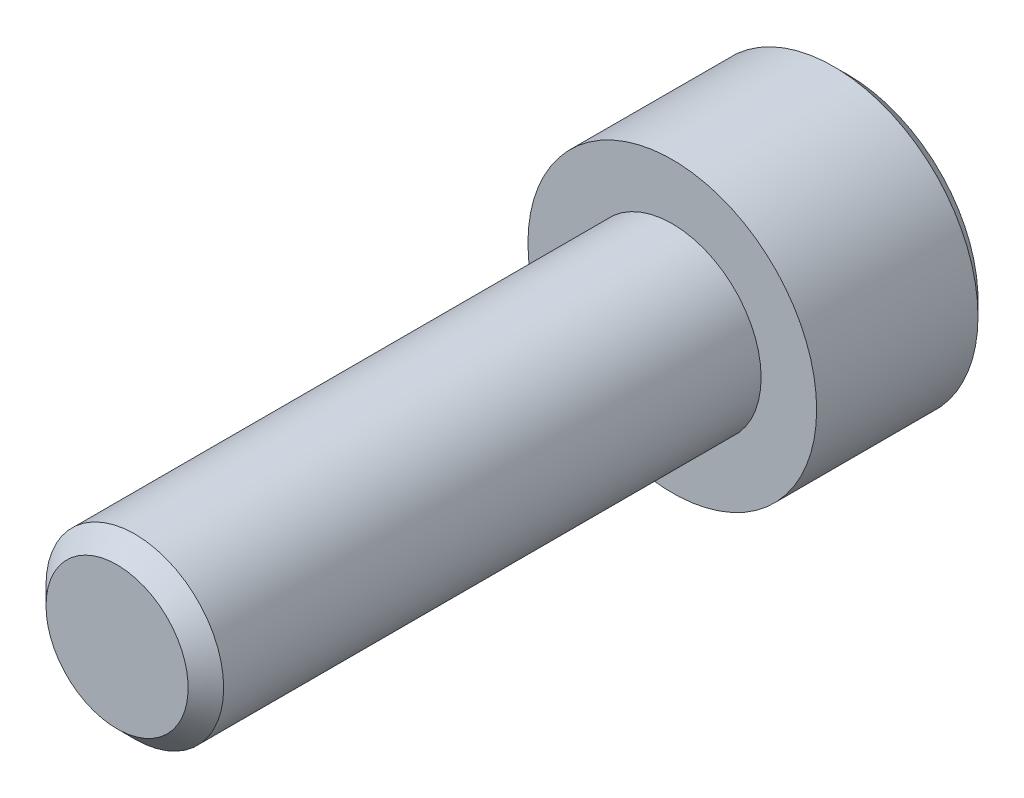
ISO-10303-21;
HEADER;
FILE_DESCRIPTION(('STEP AP214'),'2;1');
FILE_NAME('part.step','',(''),(''),'','','');
FILE_SCHEMA(('AUTOMOTIVE_DESIGN { 1 0 10303 214 1 1 1 1 }'));
ENDSEC;
DATA;
#1=APPLICATION_CONTEXT('core data for automotive mechanical design processes');
#2=APPLICATION_PROTOCOL_DEFINITION('international standard','automotive_design',2000,#1);
#3=PRODUCT_CONTEXT('',#1,'mechanical');
#4=PRODUCT('Part','Part','',(#3));
#5=PRODUCT_RELATED_PRODUCT_CATEGORY('part','',(#4));
#6=PRODUCT_DEFINITION_FORMATION('','',#4);
#7=PRODUCT_DEFINITION_CONTEXT('part definition',#1,'design');
#8=PRODUCT_DEFINITION('design','',#6,#7);
#9=PRODUCT_DEFINITION_SHAPE('','',#8);
#10=(LENGTH_UNIT() NAMED_UNIT(*) SI_UNIT(.MILLI.,.METRE.));
#11=(NAMED_UNIT(*) PLANE_ANGLE_UNIT() SI_UNIT($,.RADIAN.));
#12=(NAMED_UNIT(*) SI_UNIT($,.STERADIAN.) SOLID_ANGLE_UNIT());
#13=UNCERTAINTY_MEASURE_WITH_UNIT(LENGTH_MEASURE(1.E-05),#10,'distance_accuracy_value','');
#14=(GEOMETRIC_REPRESENTATION_CONTEXT(3) GLOBAL_UNCERTAINTY_ASSIGNED_CONTEXT((#13)) GLOBAL_UNIT_ASSIGNED_CONTEXT((#10,
#11,#12)) REPRESENTATION_CONTEXT('',''));
#15=CARTESIAN_POINT('',(0.,0.,0.));
#16=DIRECTION('',(0.,0.,1.));
#17=DIRECTION('',(1.,0.,0.));
#18=AXIS2_PLACEMENT_3D('',#15,#16,#17);
#19=CARTESIAN_POINT('',(0.,0.,-3.915));
#20=DIRECTION('',(0.,0.,1.));
#21=DIRECTION('',(1.,0.,0.));
#22=AXIS2_PLACEMENT_3D('',#19,#20,#21);
#23=PLANE('',#22);
#24=DIRECTION('',(-0.866025403784439,-0.5,0.));
#25=VECTOR('',#24,1.);
#26=CARTESIAN_POINT('',(-3.,1.73205080756888,-3.915));
#27=LINE('',#26,#25);
#28=CARTESIAN_POINT('',(-3.,1.73205080756888,-3.915));
#29=VERTEX_POINT('',#28);
#30=CARTESIAN_POINT('',(0.,3.46410161513775,-3.915));
#31=VERTEX_POINT('',#30);
#32=EDGE_CURVE('E75',#29,#31,#27,.F.);
#33=ORIENTED_EDGE('',*,*,#32,.T.);
#34=DIRECTION('',(-0.866025403784439,0.5,0.));
#35=VECTOR('',#34,1.);
#36=CARTESIAN_POINT('',(0.,3.46410161513775,-3.915));
#37=LINE('',#36,#35);
#38=CARTESIAN_POINT('',(3.,1.73205080756888,-3.915));
#39=VERTEX_POINT('',#38);
#40=EDGE_CURVE('E72',#31,#39,#37,.F.);
#41=ORIENTED_EDGE('',*,*,#40,.T.);
#42=DIRECTION('',(0.,1.,0.));
#43=VECTOR('',#42,1.);
#44=CARTESIAN_POINT('',(3.,1.73205080756888,-3.915));
#45=LINE('',#44,#43);
#46=CARTESIAN_POINT('',(3.,-1.73205080756888,-3.915));
#47=VERTEX_POINT('',#46);
#48=EDGE_CURVE('E69',#39,#47,#45,.F.);
#49=ORIENTED_EDGE('',*,*,#48,.T.);
#50=DIRECTION('',(0.866025403784439,0.499999999999999,0.));
#51=VECTOR('',#50,1.);
#52=CARTESIAN_POINT('',(3.,-1.73205080756888,-3.915));
#53=LINE('',#52,#51);
#54=CARTESIAN_POINT('',(0.,-3.46410161513775,-3.915));
#55=VERTEX_POINT('',#54);
#56=EDGE_CURVE('E99',#47,#55,#53,.F.);
#57=ORIENTED_EDGE('',*,*,#56,.T.);
#58=DIRECTION('',(0.866025403784438,-0.5,0.));
#59=VECTOR('',#58,1.);
#60=CARTESIAN_POINT('',(0.,-3.46410161513775,-3.915));
#61=LINE('',#60,#59);
#62=CARTESIAN_POINT('',(-3.,-1.73205080756888,-3.915));
#63=VERTEX_POINT('',#62);
#64=EDGE_CURVE('E151',#55,#63,#61,.F.);
#65=ORIENTED_EDGE('',*,*,#64,.T.);
#66=DIRECTION('',(0.,1.,0.));
#67=VECTOR('',#66,1.);
#68=CARTESIAN_POINT('',(-3.,-1.73205080756888,-3.915));
#69=LINE('',#68,#67);
#70=EDGE_CURVE('E144',#63,#29,#69,.T.);
#71=ORIENTED_EDGE('',*,*,#70,.T.);
#72=EDGE_LOOP('',(#33,#41,#49,#57,#65,#71));
#73=FACE_BOUND('',#72,.T.);
#74=ADVANCED_FACE('F17',(#73),#23,.F.);
#75=CARTESIAN_POINT('',(0.,3.46410161513775,-7.915));
#76=DIRECTION('',(0.5,0.866025403784439,0.));
#77=DIRECTION('',(-0.866025403784439,0.5,0.));
#78=AXIS2_PLACEMENT_3D('',#75,#76,#77);
#79=PLANE('',#78);
#80=ORIENTED_EDGE('',*,*,#40,.F.);
#81=DIRECTION('',(0.,0.,1.));
#82=VECTOR('',#81,1.);
#83=CARTESIAN_POINT('',(0.,3.46410161513776,-7.915));
#84=LINE('',#83,#82);
#85=CARTESIAN_POINT('',(0.,3.46410161513775,-7.915));
#86=VERTEX_POINT('',#85);
#87=EDGE_CURVE('E138',#31,#86,#84,.F.);
#88=ORIENTED_EDGE('',*,*,#87,.T.);
#89=DIRECTION('',(0.866025403784439,-0.499999999999998,0.));
#90=VECTOR('',#89,1.);
#91=CARTESIAN_POINT('',(0.,3.46410161513775,-7.915));
#92=LINE('',#91,#90);
#93=CARTESIAN_POINT('',(3.,1.73205080756888,-7.915));
#94=VERTEX_POINT('',#93);
#95=EDGE_CURVE('E84',#86,#94,#92,.T.);
#96=ORIENTED_EDGE('',*,*,#95,.T.);
#97=DIRECTION('',(0.,0.,-1.));
#98=VECTOR('',#97,1.);
#99=CARTESIAN_POINT('',(3.,1.73205080756888,-7.915));
#100=LINE('',#99,#98);
#101=EDGE_CURVE('E79',#94,#39,#100,.F.);
#102=ORIENTED_EDGE('',*,*,#101,.T.);
#103=EDGE_LOOP('',(#80,#88,#96,#102));
#104=FACE_BOUND('',#103,.T.);
#105=ADVANCED_FACE('F82',(#104),#79,.F.);
#106=CARTESIAN_POINT('',(3.,1.73205080756888,-7.915));
#107=DIRECTION('',(1.,0.,0.));
#108=DIRECTION('',(0.,0.,-1.));
#109=AXIS2_PLACEMENT_3D('',#106,#107,#108);
#110=PLANE('',#109);
#111=ORIENTED_EDGE('',*,*,#48,.F.);
#112=ORIENTED_EDGE('',*,*,#101,.F.);
#113=DIRECTION('',(0.,1.,0.));
#114=VECTOR('',#113,1.);
#115=CARTESIAN_POINT('',(3.,0.,-7.915));
#116=LINE('',#115,#114);
#117=CARTESIAN_POINT('',(3.,-1.73205080756888,-7.915));
#118=VERTEX_POINT('',#117);
#119=EDGE_CURVE('E133',#94,#118,#116,.F.);
#120=ORIENTED_EDGE('',*,*,#119,.T.);
#121=DIRECTION('',(0.,0.,1.));
#122=VECTOR('',#121,1.);
#123=CARTESIAN_POINT('',(3.,-1.73205080756888,-7.915));
#124=LINE('',#123,#122);
#125=EDGE_CURVE('E91',#118,#47,#124,.T.);
#126=ORIENTED_EDGE('',*,*,#125,.T.);
#127=EDGE_LOOP('',(#111,#112,#120,#126));
#128=FACE_BOUND('',#127,.T.);
#129=ADVANCED_FACE('F89',(#128),#110,.F.);
#130=CARTESIAN_POINT('',(3.,-1.73205080756888,-7.915));
#131=DIRECTION('',(0.499999999999999,-0.866025403784439,0.));
#132=DIRECTION('',(0.866025403784439,0.499999999999999,0.));
#133=AXIS2_PLACEMENT_3D('',#130,#131,#132);
#134=PLANE('',#133);
#135=ORIENTED_EDGE('',*,*,#56,.F.);
#136=ORIENTED_EDGE('',*,*,#125,.F.);
#137=DIRECTION('',(-0.86602540378444,-0.499999999999998,0.));
#138=VECTOR('',#137,1.);
#139=CARTESIAN_POINT('',(3.,-1.73205080756888,-7.915));
#140=LINE('',#139,#138);
#141=CARTESIAN_POINT('',(0.,-3.46410161513775,-7.915));
#142=VERTEX_POINT('',#141);
#143=EDGE_CURVE('E131',#118,#142,#140,.T.);
#144=ORIENTED_EDGE('',*,*,#143,.T.);
#145=DIRECTION('',(0.,0.,1.));
#146=VECTOR('',#145,1.);
#147=CARTESIAN_POINT('',(0.,-3.46410161513775,-7.915));
#148=LINE('',#147,#146);
#149=EDGE_CURVE('E154',#142,#55,#148,.T.);
#150=ORIENTED_EDGE('',*,*,#149,.T.);
#151=EDGE_LOOP('',(#135,#136,#144,#150));
#152=FACE_BOUND('',#151,.T.);
#153=ADVANCED_FACE('F161',(#152),#134,.F.);
#154=CARTESIAN_POINT('',(0.,-3.46410161513775,-7.915));
#155=DIRECTION('',(-0.5,-0.866025403784438,0.));
#156=DIRECTION('',(0.866025403784438,-0.5,0.));
#157=AXIS2_PLACEMENT_3D('',#154,#155,#156);
#158=PLANE('',#157);
#159=ORIENTED_EDGE('',*,*,#64,.F.);
#160=ORIENTED_EDGE('',*,*,#149,.F.);
#161=DIRECTION('',(-0.866025403784439,0.499999999999999,0.));
#162=VECTOR('',#161,1.);
#163=CARTESIAN_POINT('',(0.,-3.46410161513775,-7.915));
#164=LINE('',#163,#162);
#165=CARTESIAN_POINT('',(-3.,-1.73205080756888,-7.915));
#166=VERTEX_POINT('',#165);
#167=EDGE_CURVE('E128',#142,#166,#164,.T.);
#168=ORIENTED_EDGE('',*,*,#167,.T.);
#169=DIRECTION('',(0.,0.,1.));
#170=VECTOR('',#169,1.);
#171=CARTESIAN_POINT('',(-3.,-1.73205080756888,-7.915));
#172=LINE('',#171,#170);
#173=EDGE_CURVE('E147',#166,#63,#172,.T.);
#174=ORIENTED_EDGE('',*,*,#173,.T.);
#175=EDGE_LOOP('',(#159,#160,#168,#174));
#176=FACE_BOUND('',#175,.T.);
#177=ADVANCED_FACE('F165',(#176),#158,.F.);
#178=CARTESIAN_POINT('',(-3.,-1.73205080756888,-7.915));
#179=DIRECTION('',(-1.,0.,0.));
#180=DIRECTION('',(0.,0.,1.));
#181=AXIS2_PLACEMENT_3D('',#178,#179,#180);
#182=PLANE('',#181);
#183=ORIENTED_EDGE('',*,*,#70,.F.);
#184=ORIENTED_EDGE('',*,*,#173,.F.);
#185=DIRECTION('',(0.,1.,0.));
#186=VECTOR('',#185,1.);
#187=CARTESIAN_POINT('',(-3.,0.,-7.915));
#188=LINE('',#187,#186);
#189=CARTESIAN_POINT('',(-3.,1.73205080756888,-7.915));
#190=VERTEX_POINT('',#189);
#191=EDGE_CURVE('E36',#166,#190,#188,.T.);
#192=ORIENTED_EDGE('',*,*,#191,.T.);
#193=DIRECTION('',(0.,0.,1.));
#194=VECTOR('',#193,1.);
#195=CARTESIAN_POINT('',(-3.,1.73205080756888,-7.915));
#196=LINE('',#195,#194);
#197=EDGE_CURVE('E141',#190,#29,#196,.T.);
#198=ORIENTED_EDGE('',*,*,#197,.T.);
#199=EDGE_LOOP('',(#183,#184,#192,#198));
#200=FACE_BOUND('',#199,.T.);
#201=ADVANCED_FACE('F167',(#200),#182,.F.);
#202=CARTESIAN_POINT('',(-3.,1.73205080756888,-7.915));
#203=DIRECTION('',(-0.5,0.866025403784439,0.));
#204=DIRECTION('',(-0.866025403784439,-0.5,0.));
#205=AXIS2_PLACEMENT_3D('',#202,#203,#204);
#206=PLANE('',#205);
#207=ORIENTED_EDGE('',*,*,#32,.F.);
#208=ORIENTED_EDGE('',*,*,#197,.F.);
#209=DIRECTION('',(0.86602540378444,0.499999999999998,0.));
#210=VECTOR('',#209,1.);
#211=CARTESIAN_POINT('',(-3.,1.73205080756888,-7.915));
#212=LINE('',#211,#210);
#213=EDGE_CURVE('E121',#190,#86,#212,.T.);
#214=ORIENTED_EDGE('',*,*,#213,.T.);
#215=ORIENTED_EDGE('',*,*,#87,.F.);
#216=EDGE_LOOP('',(#207,#208,#214,#215));
#217=FACE_BOUND('',#216,.T.);
#218=ADVANCED_FACE('F170',(#217),#206,.F.);
#219=CARTESIAN_POINT('',(0.,0.,-7.915));
#220=DIRECTION('',(0.,0.,1.));
#221=DIRECTION('',(1.,0.,0.));
#222=AXIS2_PLACEMENT_3D('',#219,#220,#221);
#223=PLANE('',#222);
#224=ORIENTED_EDGE('',*,*,#191,.F.);
#225=ORIENTED_EDGE('',*,*,#167,.F.);
#226=ORIENTED_EDGE('',*,*,#143,.F.);
#227=ORIENTED_EDGE('',*,*,#119,.F.);
#228=ORIENTED_EDGE('',*,*,#95,.F.);
#229=ORIENTED_EDGE('',*,*,#213,.F.);
#230=EDGE_LOOP('',(#224,#225,#226,#227,#228,#229));
#231=FACE_BOUND('',#230,.T.);
#232=CARTESIAN_POINT('',(0.,0.,-7.91499999996859));
#233=DIRECTION('',(0.,0.,1.));
#234=DIRECTION('',(0.,-1.,0.));
#235=AXIS2_PLACEMENT_3D('',#232,#233,#234);
#236=CIRCLE('',#235,5.85000000012315);
#237=CARTESIAN_POINT('',(0.,-5.85000000012315,-7.91499999996859));
#238=VERTEX_POINT('',#237);
#239=EDGE_CURVE('E20',#238,#238,#236,.T.);
#240=ORIENTED_EDGE('',*,*,#239,.F.);
#241=EDGE_LOOP('',(#240));
#242=FACE_BOUND('',#241,.T.);
#243=ADVANCED_FACE('F172',(#231,#242),#223,.F.);
#244=CARTESIAN_POINT('',(0.,0.,-7.26500000013175));
#245=DIRECTION('',(0.,0.,1.));
#246=DIRECTION('',(0.,-1.,0.));
#247=AXIS2_PLACEMENT_3D('',#244,#245,#246);
#248=CONICAL_SURFACE('',#247,6.49999999995998,0.785398163397448);
#249=ORIENTED_EDGE('',*,*,#239,.T.);
#250=EDGE_LOOP('',(#249));
#251=FACE_BOUND('',#250,.T.);
#252=CARTESIAN_POINT('',(0.,0.,-7.265));
#253=DIRECTION('',(0.,0.,1.));
#254=DIRECTION('',(1.,0.,0.));
#255=AXIS2_PLACEMENT_3D('',#252,#253,#254);
#256=CIRCLE('',#255,6.5);
#257=CARTESIAN_POINT('',(6.5,0.,-7.265));
#258=VERTEX_POINT('',#257);
#259=EDGE_CURVE('E109',#258,#258,#256,.T.);
#260=ORIENTED_EDGE('',*,*,#259,.F.);
#261=EDGE_LOOP('',(#260));
#262=FACE_BOUND('',#261,.T.);
#263=ADVANCED_FACE('F175',(#251,#262),#248,.T.);
#264=CARTESIAN_POINT('',(0.,0.,25.));
#265=DIRECTION('',(0.,0.,1.));
#266=DIRECTION('',(1.,0.,0.));
#267=AXIS2_PLACEMENT_3D('',#264,#265,#266);
#268=PLANE('',#267);
#269=CARTESIAN_POINT('',(0.,0.,24.9999999999204));
#270=DIRECTION('',(0.,0.,-1.));
#271=DIRECTION('',(-1.,0.,0.));
#272=AXIS2_PLACEMENT_3D('',#269,#270,#271);
#273=CIRCLE('',#272,3.1999999999357);
#274=CARTESIAN_POINT('',(-3.1999999999357,0.,24.9999999999204));
#275=VERTEX_POINT('',#274);
#276=EDGE_CURVE('E106',#275,#275,#273,.T.);
#277=ORIENTED_EDGE('',*,*,#276,.F.);
#278=EDGE_LOOP('',(#277));
#279=FACE_BOUND('',#278,.T.);
#280=ADVANCED_FACE('F181',(#279),#268,.T.);
#281=CARTESIAN_POINT('',(0.,0.,-7.915));
#282=DIRECTION('',(0.,0.,1.));
#283=DIRECTION('',(1.,0.,0.));
#284=AXIS2_PLACEMENT_3D('',#281,#282,#283);
#285=CYLINDRICAL_SURFACE('',#284,6.5);
#286=ORIENTED_EDGE('',*,*,#259,.T.);
#287=EDGE_LOOP('',(#286));
#288=FACE_BOUND('',#287,.T.);
#289=CARTESIAN_POINT('',(0.,0.,0.));
#290=DIRECTION('',(0.,0.,1.));
#291=DIRECTION('',(1.,0.,0.));
#292=AXIS2_PLACEMENT_3D('',#289,#290,#291);
#293=CIRCLE('',#292,6.5);
#294=CARTESIAN_POINT('',(6.5,0.,0.));
#295=VERTEX_POINT('',#294);
#296=EDGE_CURVE('E103',#295,#295,#293,.T.);
#297=ORIENTED_EDGE('',*,*,#296,.F.);
#298=EDGE_LOOP('',(#297));
#299=FACE_BOUND('',#298,.T.);
#300=ADVANCED_FACE('F186',(#288,#299),#285,.T.);
#301=CARTESIAN_POINT('',(0.,0.,24.2000000000644));
#302=DIRECTION('',(0.,0.,-1.));
#303=DIRECTION('',(-1.,0.,0.));
#304=AXIS2_PLACEMENT_3D('',#301,#302,#303);
#305=CONICAL_SURFACE('',#304,3.99999999984857,0.785398163432975);
#306=CARTESIAN_POINT('',(0.,0.,24.2));
#307=DIRECTION('',(0.,0.,1.));
#308=DIRECTION('',(1.,0.,0.));
#309=AXIS2_PLACEMENT_3D('',#306,#307,#308);
#310=CIRCLE('',#309,4.);
#311=CARTESIAN_POINT('',(4.,0.,24.2));
#312=VERTEX_POINT('',#311);
#313=EDGE_CURVE('E27',#312,#312,#310,.F.);
#314=ORIENTED_EDGE('',*,*,#313,.F.);
#315=EDGE_LOOP('',(#314));
#316=FACE_BOUND('',#315,.T.);
#317=ORIENTED_EDGE('',*,*,#276,.T.);
#318=EDGE_LOOP('',(#317));
#319=FACE_BOUND('',#318,.T.);
#320=ADVANCED_FACE('F196',(#316,#319),#305,.T.);
#321=CARTESIAN_POINT('',(0.,0.,0.));
#322=DIRECTION('',(0.,0.,1.));
#323=DIRECTION('',(1.,0.,0.));
#324=AXIS2_PLACEMENT_3D('',#321,#322,#323);
#325=PLANE('',#324);
#326=CARTESIAN_POINT('',(0.,0.,0.));
#327=DIRECTION('',(0.,0.,1.));
#328=DIRECTION('',(1.,0.,0.));
#329=AXIS2_PLACEMENT_3D('',#326,#327,#328);
#330=CIRCLE('',#329,4.);
#331=CARTESIAN_POINT('',(4.,0.,0.));
#332=VERTEX_POINT('',#331);
#333=EDGE_CURVE('E11',#332,#332,#330,.T.);
#334=ORIENTED_EDGE('',*,*,#333,.F.);
#335=EDGE_LOOP('',(#334));
#336=FACE_BOUND('',#335,.T.);
#337=ORIENTED_EDGE('',*,*,#296,.T.);
#338=EDGE_LOOP('',(#337));
#339=FACE_BOUND('',#338,.T.);
#340=ADVANCED_FACE('F191',(#336,#339),#325,.T.);
#341=CARTESIAN_POINT('',(0.,0.,0.));
#342=DIRECTION('',(0.,0.,1.));
#343=DIRECTION('',(1.,0.,0.));
#344=AXIS2_PLACEMENT_3D('',#341,#342,#343);
#345=CYLINDRICAL_SURFACE('',#344,4.);
#346=ORIENTED_EDGE('',*,*,#333,.T.);
#347=EDGE_LOOP('',(#346));
#348=FACE_BOUND('',#347,.T.);
#349=ORIENTED_EDGE('',*,*,#313,.T.);
#350=EDGE_LOOP('',(#349));
#351=FACE_BOUND('',#350,.T.);
#352=ADVANCED_FACE('F189',(#348,#351),#345,.T.);
#353=CLOSED_SHELL('',(#74,#105,#129,#153,#177,#201,#218,#243,#263,#280,#300,#320,#340,#352));
#354=MANIFOLD_SOLID_BREP('B1',#353);
#355=ADVANCED_BREP_SHAPE_REPRESENTATION('',(#18,#354),#14);
#356=SHAPE_DEFINITION_REPRESENTATION(#9,#355);
ENDSEC;
END-ISO-10303-21;
